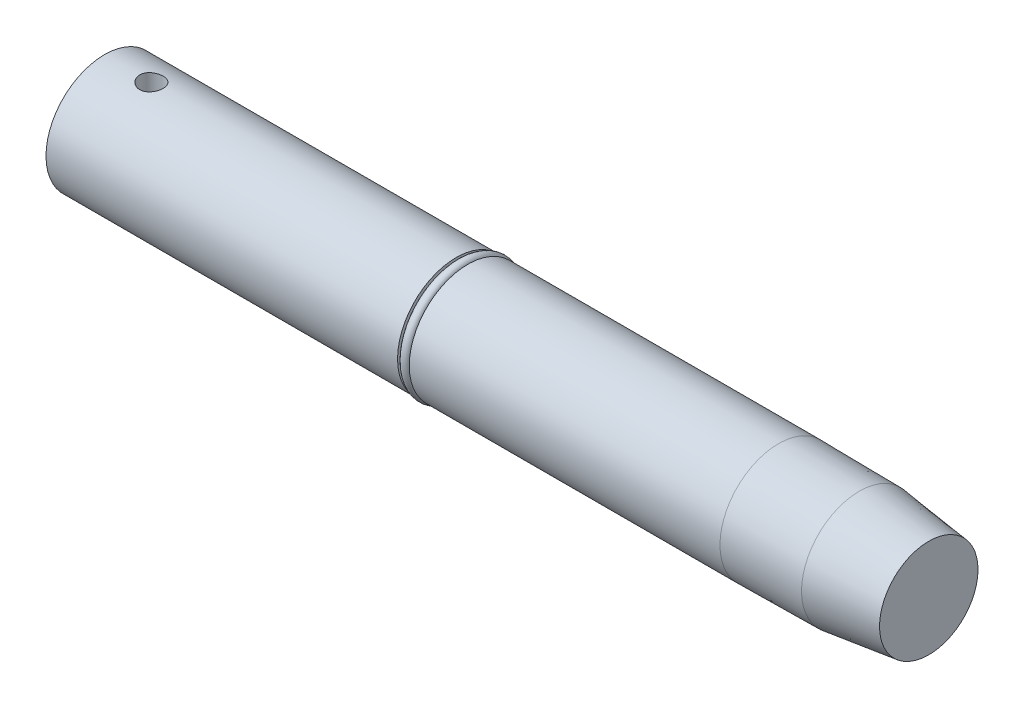
ISO-10303-21;
HEADER;
FILE_DESCRIPTION(('STEP AP214'),'2;1');
FILE_NAME('part.step','',(''),(''),'','','');
FILE_SCHEMA(('AUTOMOTIVE_DESIGN { 1 0 10303 214 1 1 1 1 }'));
ENDSEC;
DATA;
#1=APPLICATION_CONTEXT('core data for automotive mechanical design processes');
#2=APPLICATION_PROTOCOL_DEFINITION('international standard','automotive_design',2000,#1);
#3=PRODUCT_CONTEXT('',#1,'mechanical');
#4=PRODUCT('Part','Part','',(#3));
#5=PRODUCT_RELATED_PRODUCT_CATEGORY('part','',(#4));
#6=PRODUCT_DEFINITION_FORMATION('','',#4);
#7=PRODUCT_DEFINITION_CONTEXT('part definition',#1,'design');
#8=PRODUCT_DEFINITION('design','',#6,#7);
#9=PRODUCT_DEFINITION_SHAPE('','',#8);
#10=(LENGTH_UNIT() NAMED_UNIT(*) SI_UNIT(.MILLI.,.METRE.));
#11=(NAMED_UNIT(*) PLANE_ANGLE_UNIT() SI_UNIT($,.RADIAN.));
#12=(NAMED_UNIT(*) SI_UNIT($,.STERADIAN.) SOLID_ANGLE_UNIT());
#13=UNCERTAINTY_MEASURE_WITH_UNIT(LENGTH_MEASURE(1.E-05),#10,'distance_accuracy_value','');
#14=(GEOMETRIC_REPRESENTATION_CONTEXT(3) GLOBAL_UNCERTAINTY_ASSIGNED_CONTEXT((#13)) GLOBAL_UNIT_ASSIGNED_CONTEXT((#10,
#11,#12)) REPRESENTATION_CONTEXT('',''));
#15=CARTESIAN_POINT('',(0.,0.,0.));
#16=DIRECTION('',(0.,0.,1.));
#17=DIRECTION('',(1.,0.,0.));
#18=AXIS2_PLACEMENT_3D('',#15,#16,#17);
#19=CARTESIAN_POINT('',(91.5250642228962,0.,0.));
#20=DIRECTION('',(-1.,0.,0.));
#21=DIRECTION('',(0.,0.,1.));
#22=AXIS2_PLACEMENT_3D('',#19,#20,#21);
#23=TOROIDAL_SURFACE('',#22,14.1970338752884,1.2);
#24=CARTESIAN_POINT('',(91.5250642228962,0.,15.3970338752884));
#25=VERTEX_POINT('',#24);
#26=VERTEX_LOOP('',#25);
#27=FACE_BOUND('',#26,.T.);
#28=ADVANCED_FACE('F49',(#27),#23,.T.);
#29=CLOSED_SHELL('',(#28));
#30=MANIFOLD_SOLID_BREP('B2',#29);
#31=CARTESIAN_POINT('',(211.,0.,0.));
#32=DIRECTION('',(-1.,0.,0.));
#33=DIRECTION('',(0.,0.,1.));
#34=AXIS2_PLACEMENT_3D('',#31,#32,#33);
#35=CYLINDRICAL_SURFACE('',#34,15.);
#36=CARTESIAN_POINT('',(172.539848215101,0.,0.));
#37=DIRECTION('',(-1.,0.,0.));
#38=DIRECTION('',(0.,0.,1.));
#39=AXIS2_PLACEMENT_3D('',#36,#37,#38);
#40=CIRCLE('',#39,15.);
#41=CARTESIAN_POINT('',(172.539848215101,0.,15.));
#42=VERTEX_POINT('',#41);
#43=EDGE_CURVE('E129',#42,#42,#40,.T.);
#44=ORIENTED_EDGE('',*,*,#43,.T.);
#45=EDGE_LOOP('',(#44));
#46=FACE_BOUND('',#45,.T.);
#47=CARTESIAN_POINT('',(93.,0.,0.));
#48=DIRECTION('',(-1.,0.,0.));
#49=DIRECTION('',(0.,0.,1.));
#50=AXIS2_PLACEMENT_3D('',#47,#48,#49);
#51=CIRCLE('',#50,15.);
#52=CARTESIAN_POINT('',(93.,0.,15.));
#53=VERTEX_POINT('',#52);
#54=EDGE_CURVE('E132',#53,#53,#51,.T.);
#55=ORIENTED_EDGE('',*,*,#54,.F.);
#56=EDGE_LOOP('',(#55));
#57=FACE_BOUND('',#56,.T.);
#58=ADVANCED_FACE('F68',(#46,#57),#35,.T.);
#59=CARTESIAN_POINT('',(172.539848215101,0.,0.));
#60=DIRECTION('',(-1.,0.,0.));
#61=DIRECTION('',(0.,0.,1.));
#62=AXIS2_PLACEMENT_3D('',#59,#60,#61);
#63=CONICAL_SURFACE('',#62,15.,0.0103999999999929);
#64=CARTESIAN_POINT('',(193.203901879844,0.,0.));
#65=DIRECTION('',(1.,0.,0.));
#66=DIRECTION('',(0.,0.,-1.));
#67=AXIS2_PLACEMENT_3D('',#64,#65,#66);
#68=CIRCLE('',#67,14.7850860934682);
#69=CARTESIAN_POINT('',(193.203901879844,0.,-14.7850860934682));
#70=VERTEX_POINT('',#69);
#71=EDGE_CURVE('E75',#70,#70,#68,.F.);
#72=ORIENTED_EDGE('',*,*,#71,.T.);
#73=EDGE_LOOP('',(#72));
#74=FACE_BOUND('',#73,.T.);
#75=ORIENTED_EDGE('',*,*,#43,.F.);
#76=EDGE_LOOP('',(#75));
#77=FACE_BOUND('',#76,.T.);
#78=ADVANCED_FACE('F106',(#74,#77),#63,.T.);
#79=CARTESIAN_POINT('',(211.,0.,0.));
#80=DIRECTION('',(1.,0.,0.));
#81=DIRECTION('',(0.,0.,-1.));
#82=AXIS2_PLACEMENT_3D('',#79,#80,#81);
#83=PLANE('',#82);
#84=CARTESIAN_POINT('',(211.,0.,0.));
#85=DIRECTION('',(1.,0.,0.));
#86=DIRECTION('',(0.,0.,-1.));
#87=AXIS2_PLACEMENT_3D('',#84,#85,#86);
#88=CIRCLE('',#87,12.5999999999999);
#89=CARTESIAN_POINT('',(211.,0.,-12.5999999999999));
#90=VERTEX_POINT('',#89);
#91=EDGE_CURVE('E48',#90,#90,#88,.T.);
#92=ORIENTED_EDGE('',*,*,#91,.T.);
#93=EDGE_LOOP('',(#92));
#94=FACE_BOUND('',#93,.T.);
#95=ADVANCED_FACE('F108',(#94),#83,.T.);
#96=CARTESIAN_POINT('',(193.203901879844,0.,0.));
#97=DIRECTION('',(-1.,0.,0.));
#98=DIRECTION('',(0.,0.,1.));
#99=AXIS2_PLACEMENT_3D('',#96,#97,#98);
#100=CONICAL_SURFACE('',#99,14.7850860934682,0.1221730476396);
#101=ORIENTED_EDGE('',*,*,#91,.F.);
#102=EDGE_LOOP('',(#101));
#103=FACE_BOUND('',#102,.T.);
#104=ORIENTED_EDGE('',*,*,#71,.F.);
#105=EDGE_LOOP('',(#104));
#106=FACE_BOUND('',#105,.T.);
#107=ADVANCED_FACE('F70',(#103,#106),#100,.T.);
#108=CARTESIAN_POINT('',(93.,15.,0.));
#109=DIRECTION('',(-1.,0.,0.));
#110=DIRECTION('',(0.,0.,1.));
#111=AXIS2_PLACEMENT_3D('',#108,#109,#110);
#112=PLANE('',#111);
#113=ORIENTED_EDGE('',*,*,#54,.T.);
#114=EDGE_LOOP('',(#113));
#115=FACE_BOUND('',#114,.T.);
#116=CARTESIAN_POINT('',(93.,0.,0.));
#117=DIRECTION('',(-1.,0.,0.));
#118=DIRECTION('',(0.,0.,1.));
#119=AXIS2_PLACEMENT_3D('',#116,#117,#118);
#120=CIRCLE('',#119,12.9);
#121=CARTESIAN_POINT('',(93.,0.,12.9));
#122=VERTEX_POINT('',#121);
#123=EDGE_CURVE('E142',#122,#122,#120,.T.);
#124=ORIENTED_EDGE('',*,*,#123,.F.);
#125=EDGE_LOOP('',(#124));
#126=FACE_BOUND('',#125,.T.);
#127=ADVANCED_FACE('F161',(#115,#126),#112,.T.);
#128=CARTESIAN_POINT('',(98.888949173247,0.,0.));
#129=DIRECTION('',(-1.,0.,0.));
#130=DIRECTION('',(0.,0.,1.));
#131=AXIS2_PLACEMENT_3D('',#128,#129,#130);
#132=CYLINDRICAL_SURFACE('',#131,12.9);
#133=ORIENTED_EDGE('',*,*,#123,.T.);
#134=EDGE_LOOP('',(#133));
#135=FACE_BOUND('',#134,.T.);
#136=CARTESIAN_POINT('',(90.,0.,0.));
#137=DIRECTION('',(-1.,0.,0.));
#138=DIRECTION('',(0.,0.,1.));
#139=AXIS2_PLACEMENT_3D('',#136,#137,#138);
#140=CIRCLE('',#139,12.9);
#141=CARTESIAN_POINT('',(90.,0.,12.9));
#142=VERTEX_POINT('',#141);
#143=EDGE_CURVE('E137',#142,#142,#140,.T.);
#144=ORIENTED_EDGE('',*,*,#143,.F.);
#145=EDGE_LOOP('',(#144));
#146=FACE_BOUND('',#145,.T.);
#147=ADVANCED_FACE('F155',(#135,#146),#132,.T.);
#148=CARTESIAN_POINT('',(90.,15.,0.));
#149=DIRECTION('',(1.,0.,0.));
#150=DIRECTION('',(0.,0.,-1.));
#151=AXIS2_PLACEMENT_3D('',#148,#149,#150);
#152=PLANE('',#151);
#153=ORIENTED_EDGE('',*,*,#143,.T.);
#154=EDGE_LOOP('',(#153));
#155=FACE_BOUND('',#154,.T.);
#156=CARTESIAN_POINT('',(90.,0.,0.));
#157=DIRECTION('',(-1.,0.,0.));
#158=DIRECTION('',(0.,0.,1.));
#159=AXIS2_PLACEMENT_3D('',#156,#157,#158);
#160=CIRCLE('',#159,15.);
#161=CARTESIAN_POINT('',(90.,0.,15.));
#162=VERTEX_POINT('',#161);
#163=EDGE_CURVE('E134',#162,#162,#160,.T.);
#164=ORIENTED_EDGE('',*,*,#163,.F.);
#165=EDGE_LOOP('',(#164));
#166=FACE_BOUND('',#165,.T.);
#167=ADVANCED_FACE('F104',(#155,#166),#152,.T.);
#168=CARTESIAN_POINT('',(12.,199.,0.));
#169=DIRECTION('',(0.,-1.,0.));
#170=DIRECTION('',(0.,0.,-1.));
#171=AXIS2_PLACEMENT_3D('',#168,#169,#170);
#172=CYLINDRICAL_SURFACE('',#171,3.);
#173=CARTESIAN_POINT('',(12.,-14.6969384566991,-3.));
#174=CARTESIAN_POINT('',(12.1666931264735,-14.6969417707994,-2.99999383762581));
#175=CARTESIAN_POINT('',(12.33346387,-14.6998052480611,-2.98605951515443));
#176=CARTESIAN_POINT('',(12.6622875154294,-14.7109329391462,-2.93073685074852));
#177=CARTESIAN_POINT('',(12.8243365339079,-14.7192014743436,-2.88932654121148));
#178=CARTESIAN_POINT('',(13.1389119100626,-14.7401662116556,-2.78038734785923));
#179=CARTESIAN_POINT('',(13.2914475645978,-14.7528580086323,-2.71288444245786));
#180=CARTESIAN_POINT('',(13.5830245340909,-14.7812339844198,-2.55374732301151));
#181=CARTESIAN_POINT('',(13.7220666016137,-14.7969179962038,-2.46211445580345));
#182=CARTESIAN_POINT('',(13.9846830115616,-14.8297589908276,-2.25593722696031));
#183=CARTESIAN_POINT('',(14.1080387636519,-14.8469321351174,-2.14111696773995));
#184=CARTESIAN_POINT('',(14.3338726007369,-14.880674169078,-1.89242036706393));
#185=CARTESIAN_POINT('',(14.4363492222516,-14.8972430163249,-1.75854269093395));
#186=CARTESIAN_POINT('',(14.6183640528854,-14.9280838925269,-1.47408406777276));
#187=CARTESIAN_POINT('',(14.6976945414499,-14.9423346432465,-1.32336770301663));
#188=CARTESIAN_POINT('',(14.8298248111444,-14.9667521065089,-1.01041245116181));
#189=CARTESIAN_POINT('',(14.882627075703,-14.9769192013236,-0.848174644261658));
#190=CARTESIAN_POINT('',(14.9595215808589,-14.9919096206526,-0.519050319835482));
#191=CARTESIAN_POINT('',(14.983982932713,-14.9968015886438,-0.352253217644441));
#192=CARTESIAN_POINT('',(15.0046528555149,-15.0009276355081,-0.016855705312608));
#193=CARTESIAN_POINT('',(15.0008641489375,-15.0001622595828,0.15174452949553));
#194=CARTESIAN_POINT('',(14.9654214593533,-14.9931130460555,0.483426002230766));
#195=CARTESIAN_POINT('',(14.9341650684965,-14.9869079509751,0.64655164289541));
#196=CARTESIAN_POINT('',(14.8453049026233,-14.9697653147823,0.965194879740903));
#197=CARTESIAN_POINT('',(14.7877000734244,-14.9588275843212,1.12071217124139));
#198=CARTESIAN_POINT('',(14.6474098795582,-14.9333188805988,1.42085838960266));
#199=CARTESIAN_POINT('',(14.5645687466853,-14.9187254452567,1.5654125224017));
#200=CARTESIAN_POINT('',(14.3762727682902,-14.8875140842136,1.83871513757927));
#201=CARTESIAN_POINT('',(14.2708153206885,-14.8708959256567,1.967461798575));
#202=CARTESIAN_POINT('',(14.0380991336746,-14.8371289309338,2.20785429316037));
#203=CARTESIAN_POINT('',(13.9104924398112,-14.8199758937255,2.31916294972089));
#204=CARTESIAN_POINT('',(13.6382506726477,-14.7873471479628,2.51885547953042));
#205=CARTESIAN_POINT('',(13.4936152773504,-14.7718714711364,2.60723891918325));
#206=CARTESIAN_POINT('',(13.1909375045346,-14.7443414241877,2.75868844440564));
#207=CARTESIAN_POINT('',(13.032867097081,-14.7322944469065,2.82169994333313));
#208=CARTESIAN_POINT('',(12.708086028828,-14.7130942896382,2.92017102488274));
#209=CARTESIAN_POINT('',(12.5413764971427,-14.7059404718528,2.95563419836992));
#210=CARTESIAN_POINT('',(12.2071054260029,-14.6974643780348,2.99749801810815));
#211=CARTESIAN_POINT('',(12.039607277069,-14.6960444117146,3.00438557669373));
#212=CARTESIAN_POINT('',(11.7058553304009,-14.6989345706656,2.99021288493221));
#213=CARTESIAN_POINT('',(11.5396014626434,-14.7032443710116,2.96915421936732));
#214=CARTESIAN_POINT('',(11.2146940791233,-14.7170169748474,2.90010662422247));
#215=CARTESIAN_POINT('',(11.0559829708927,-14.7264299704349,2.85237786251789));
#216=CARTESIAN_POINT('',(10.7488101629138,-14.7493046805499,2.73162310592555));
#217=CARTESIAN_POINT('',(10.6003493086928,-14.7627667285881,2.65859502711953));
#218=CARTESIAN_POINT('',(10.3157606701495,-14.7924421788612,2.48821242664679));
#219=CARTESIAN_POINT('',(10.1798188610975,-14.8086891559471,2.39055323394826));
#220=CARTESIAN_POINT('',(9.92607506399725,-14.8420117147991,2.17408671663813));
#221=CARTESIAN_POINT('',(9.80827494525224,-14.8590873817145,2.05527721543361));
#222=CARTESIAN_POINT('',(9.59231232244327,-14.8924603760765,1.79769682049367));
#223=CARTESIAN_POINT('',(9.49447903605001,-14.9087417312605,1.65864749678889));
#224=CARTESIAN_POINT('',(9.32356235550125,-14.9384138288586,1.36580368990426));
#225=CARTESIAN_POINT('',(9.25047792196566,-14.9518046926563,1.21200982630052));
#226=CARTESIAN_POINT('',(9.1316133847601,-14.974118821832,0.894908042472038));
#227=CARTESIAN_POINT('',(9.08567844532124,-14.9830673742781,0.731660020434235));
#228=CARTESIAN_POINT('',(9.02192625700847,-14.9955970781298,0.399568364039736));
#229=CARTESIAN_POINT('',(9.00410562157297,-14.9991788759955,0.230725406133635));
#230=CARTESIAN_POINT('',(8.99721905711133,-15.0005562136234,-0.104618681710864));
#231=CARTESIAN_POINT('',(9.00765815863132,-14.9984513564799,-0.271109436424482));
#232=CARTESIAN_POINT('',(9.05590185164349,-14.9889013068102,-0.599913093946949));
#233=CARTESIAN_POINT('',(9.0937060990444,-14.9814561814329,-0.762226049261167));
#234=CARTESIAN_POINT('',(9.19538697627477,-14.9620649509476,-1.07775824923519));
#235=CARTESIAN_POINT('',(9.25920413439293,-14.9501291174284,-1.23099732972049));
#236=CARTESIAN_POINT('',(9.41103672399333,-14.9230416637104,-1.52466366055821));
#237=CARTESIAN_POINT('',(9.4990540677135,-14.9078897894096,-1.66508989730354));
#238=CARTESIAN_POINT('',(9.69845816118386,-14.8757279747022,-1.93159167031775));
#239=CARTESIAN_POINT('',(9.81019900915133,-14.858692002537,-2.05739914834453));
#240=CARTESIAN_POINT('',(10.0531507202963,-14.8248366872359,-2.28864785327552));
#241=CARTESIAN_POINT('',(10.1843661884398,-14.8080173963616,-2.39408424962674));
#242=CARTESIAN_POINT('',(10.4642379500713,-14.7763002820179,-2.58267665834994));
#243=CARTESIAN_POINT('',(10.6130668833638,-14.7614251071368,-2.66558044385427));
#244=CARTESIAN_POINT('',(10.9227983197803,-14.7355571137924,-2.80507214779868));
#245=CARTESIAN_POINT('',(11.0836897160616,-14.7245607757495,-2.86168393792249));
#246=CARTESIAN_POINT('',(11.3707873663286,-14.7098904341354,-2.93600741957296));
#247=CARTESIAN_POINT('',(11.4953562585419,-14.7050635474382,-2.95996169557105));
#248=CARTESIAN_POINT('',(11.7466018636534,-14.6985863537725,-2.99196005387913));
#249=CARTESIAN_POINT('',(11.8732785037334,-14.6969359372925,-3.00000468468793));
#250=CARTESIAN_POINT('',(12.,-14.6969384566991,-3.));
#251=B_SPLINE_CURVE_WITH_KNOTS('',3,(#173,#174,#175,#176,#177,#178,#179,#180,#181,#182,#183,
#184,#185,#186,#187,#188,#189,#190,#191,#192,#193,#194,#195,#196,#197,#198,#199,#200,#201,#202,
#203,#204,#205,#206,#207,#208,#209,#210,#211,#212,#213,#214,#215,#216,#217,#218,#219,#220,#221,
#222,#223,#224,#225,#226,#227,#228,#229,#230,#231,#232,#233,#234,#235,#236,#237,#238,#239,#240,
#241,#242,#243,#244,#245,#246,#247,#248,#249,#250),.UNSPECIFIED.,.T.,.F.,(4,2,2,2,2,2,2,2,2,2,2,
2,2,2,2,2,2,2,2,2,2,2,2,2,2,2,2,2,2,2,2,2,2,2,2,2,2,2,4),(0.,0.499615391608285,
0.999630717852889,1.49914949382176,1.99864039457959,2.5044675764531,3.01033020106266,
3.5206020131235,4.03082604739679,4.53432746649241,5.03778036348745,5.53406368900612,
6.0303668722125,6.52979772666909,7.02928607310198,7.5374804028745,8.04568434368161,
8.55497589518329,9.06420105048074,9.5647127341378,10.0651960358526,10.5608802534996,
11.0566053106319,11.5587917932356,12.0610299861063,12.5709780520035,13.0809046989031,
13.5878944073595,14.0948230407488,14.5929305224406,15.0910317410027,15.5880005122635,
16.0850085640405,16.5900345607679,17.0951801666934,17.6057669573882,18.1158892527059,
18.4957141091448,18.8755258705644),.UNSPECIFIED.);
#252=CARTESIAN_POINT('',(12.,-14.6969384566991,-3.));
#253=VERTEX_POINT('',#252);
#254=EDGE_CURVE('E92',#253,#253,#251,.T.);
#255=ORIENTED_EDGE('',*,*,#254,.T.);
#256=EDGE_LOOP('',(#255));
#257=FACE_BOUND('',#256,.T.);
#258=CARTESIAN_POINT('',(12.,14.6969384566991,-3.));
#259=CARTESIAN_POINT('',(11.8333068735265,14.6969417707994,-2.99999383762581));
#260=CARTESIAN_POINT('',(11.66653613,14.6998052480611,-2.98605951515443));
#261=CARTESIAN_POINT('',(11.3377124845706,14.7109329391462,-2.93073685074852));
#262=CARTESIAN_POINT('',(11.1756634660921,14.7192014743436,-2.88932654121148));
#263=CARTESIAN_POINT('',(10.8610880899374,14.7401662116556,-2.78038734785923));
#264=CARTESIAN_POINT('',(10.7085524354022,14.7528580086323,-2.71288444245786));
#265=CARTESIAN_POINT('',(10.4169754659091,14.7812339844198,-2.55374732301151));
#266=CARTESIAN_POINT('',(10.2779333983863,14.7969179962038,-2.46211445580345));
#267=CARTESIAN_POINT('',(10.0153169884384,14.8297589908276,-2.25593722696031));
#268=CARTESIAN_POINT('',(9.89196123634808,14.8469321351174,-2.14111696773995));
#269=CARTESIAN_POINT('',(9.66612739926306,14.880674169078,-1.89242036706393));
#270=CARTESIAN_POINT('',(9.56365077774842,14.8972430163249,-1.75854269093395));
#271=CARTESIAN_POINT('',(9.38163594711462,14.9280838925269,-1.47408406777276));
#272=CARTESIAN_POINT('',(9.30230545855008,14.9423346432465,-1.32336770301663));
#273=CARTESIAN_POINT('',(9.17017518885559,14.9667521065089,-1.01041245116181));
#274=CARTESIAN_POINT('',(9.11737292429703,14.9769192013236,-0.848174644261657));
#275=CARTESIAN_POINT('',(9.04047841914113,14.9919096206526,-0.519050319835482));
#276=CARTESIAN_POINT('',(9.01601706728698,14.9968015886438,-0.352253217644441));
#277=CARTESIAN_POINT('',(8.99534714448506,15.0009276355081,-0.016855705312608));
#278=CARTESIAN_POINT('',(8.99913585106254,15.0001622595828,0.15174452949553));
#279=CARTESIAN_POINT('',(9.03457854064667,14.9931130460555,0.483426002230766));
#280=CARTESIAN_POINT('',(9.06583493150355,14.9869079509751,0.64655164289541));
#281=CARTESIAN_POINT('',(9.15469509737668,14.9697653147823,0.965194879740903));
#282=CARTESIAN_POINT('',(9.21229992657562,14.9588275843212,1.12071217124139));
#283=CARTESIAN_POINT('',(9.35259012044181,14.9333188805988,1.42085838960266));
#284=CARTESIAN_POINT('',(9.43543125331467,14.9187254452567,1.5654125224017));
#285=CARTESIAN_POINT('',(9.6237272317098,14.8875140842136,1.83871513757927));
#286=CARTESIAN_POINT('',(9.72918467931155,14.8708959256567,1.967461798575));
#287=CARTESIAN_POINT('',(9.96190086632542,14.8371289309338,2.20785429316037));
#288=CARTESIAN_POINT('',(10.0895075601888,14.8199758937255,2.31916294972089));
#289=CARTESIAN_POINT('',(10.3617493273523,14.7873471479628,2.51885547953042));
#290=CARTESIAN_POINT('',(10.5063847226496,14.7718714711364,2.60723891918325));
#291=CARTESIAN_POINT('',(10.8090624954654,14.7443414241877,2.75868844440564));
#292=CARTESIAN_POINT('',(10.967132902919,14.7322944469065,2.82169994333313));
#293=CARTESIAN_POINT('',(11.291913971172,14.7130942896382,2.92017102488274));
#294=CARTESIAN_POINT('',(11.4586235028573,14.7059404718528,2.95563419836993));
#295=CARTESIAN_POINT('',(11.7928945739971,14.6974643780348,2.99749801810815));
#296=CARTESIAN_POINT('',(11.960392722931,14.6960444117146,3.00438557669373));
#297=CARTESIAN_POINT('',(12.2941446695991,14.6989345706656,2.99021288493221));
#298=CARTESIAN_POINT('',(12.4603985373566,14.7032443710116,2.96915421936732));
#299=CARTESIAN_POINT('',(12.7853059208767,14.7170169748474,2.90010662422247));
#300=CARTESIAN_POINT('',(12.9440170291073,14.7264299704349,2.85237786251789));
#301=CARTESIAN_POINT('',(13.2511898370862,14.7493046805499,2.73162310592555));
#302=CARTESIAN_POINT('',(13.3996506913072,14.7627667285881,2.65859502711953));
#303=CARTESIAN_POINT('',(13.6842393298505,14.7924421788612,2.48821242664679));
#304=CARTESIAN_POINT('',(13.8201811389025,14.8086891559471,2.39055323394826));
#305=CARTESIAN_POINT('',(14.0739249360027,14.8420117147991,2.17408671663813));
#306=CARTESIAN_POINT('',(14.1917250547478,14.8590873817145,2.05527721543361));
#307=CARTESIAN_POINT('',(14.4076876775567,14.8924603760765,1.79769682049367));
#308=CARTESIAN_POINT('',(14.50552096395,14.9087417312605,1.65864749678889));
#309=CARTESIAN_POINT('',(14.6764376444987,14.9384138288586,1.36580368990426));
#310=CARTESIAN_POINT('',(14.7495220780343,14.9518046926563,1.21200982630052));
#311=CARTESIAN_POINT('',(14.8683866152399,14.974118821832,0.894908042472038));
#312=CARTESIAN_POINT('',(14.9143215546788,14.9830673742781,0.731660020434235));
#313=CARTESIAN_POINT('',(14.9780737429915,14.9955970781298,0.399568364039735));
#314=CARTESIAN_POINT('',(14.995894378427,14.9991788759955,0.230725406133635));
#315=CARTESIAN_POINT('',(15.0027809428887,15.0005562136234,-0.104618681710864));
#316=CARTESIAN_POINT('',(14.9923418413687,14.9984513564799,-0.271109436424482));
#317=CARTESIAN_POINT('',(14.9440981483565,14.9889013068102,-0.599913093946949));
#318=CARTESIAN_POINT('',(14.9062939009556,14.9814561814329,-0.762226049261167));
#319=CARTESIAN_POINT('',(14.8046130237252,14.9620649509476,-1.07775824923519));
#320=CARTESIAN_POINT('',(14.7407958656071,14.9501291174284,-1.23099732972049));
#321=CARTESIAN_POINT('',(14.5889632760067,14.9230416637104,-1.52466366055821));
#322=CARTESIAN_POINT('',(14.5009459322865,14.9078897894096,-1.66508989730354));
#323=CARTESIAN_POINT('',(14.3015418388161,14.8757279747022,-1.93159167031775));
#324=CARTESIAN_POINT('',(14.1898009908487,14.858692002537,-2.05739914834453));
#325=CARTESIAN_POINT('',(13.9468492797037,14.8248366872359,-2.28864785327552));
#326=CARTESIAN_POINT('',(13.8156338115602,14.8080173963616,-2.39408424962674));
#327=CARTESIAN_POINT('',(13.5357620499287,14.7763002820179,-2.58267665834994));
#328=CARTESIAN_POINT('',(13.3869331166362,14.7614251071368,-2.66558044385427));
#329=CARTESIAN_POINT('',(13.0772016802197,14.7355571137924,-2.80507214779868));
#330=CARTESIAN_POINT('',(12.9163102839384,14.7245607757495,-2.86168393792249));
#331=CARTESIAN_POINT('',(12.6292126336714,14.7098904341354,-2.93600741957296));
#332=CARTESIAN_POINT('',(12.5046437414581,14.7050635474382,-2.95996169557105));
#333=CARTESIAN_POINT('',(12.2533981363466,14.6985863537725,-2.99196005387913));
#334=CARTESIAN_POINT('',(12.1267214962666,14.6969359372925,-3.00000468468793));
#335=CARTESIAN_POINT('',(12.,14.6969384566991,-3.));
#336=B_SPLINE_CURVE_WITH_KNOTS('',3,(#258,#259,#260,#261,#262,#263,#264,#265,#266,#267,#268,
#269,#270,#271,#272,#273,#274,#275,#276,#277,#278,#279,#280,#281,#282,#283,#284,#285,#286,#287,
#288,#289,#290,#291,#292,#293,#294,#295,#296,#297,#298,#299,#300,#301,#302,#303,#304,#305,#306,
#307,#308,#309,#310,#311,#312,#313,#314,#315,#316,#317,#318,#319,#320,#321,#322,#323,#324,#325,
#326,#327,#328,#329,#330,#331,#332,#333,#334,#335),.UNSPECIFIED.,.T.,.F.,(4,2,2,2,2,2,2,2,2,2,2,
2,2,2,2,2,2,2,2,2,2,2,2,2,2,2,2,2,2,2,2,2,2,2,2,2,2,2,4),(0.,0.499615391608285,
0.999630717852889,1.49914949382176,1.99864039457959,2.5044675764531,3.01033020106266,
3.52060201312351,4.03082604739679,4.53432746649241,5.03778036348744,5.53406368900612,
6.0303668722125,6.52979772666909,7.02928607310198,7.53748040287449,8.0456843436816,
8.5549758951833,9.06420105048074,9.5647127341378,10.0651960358526,10.5608802534996,
11.0566053106319,11.5587917932356,12.0610299861063,12.5709780520035,13.0809046989031,
13.5878944073595,14.0948230407488,14.5929305224406,15.0910317410027,15.5880005122635,
16.0850085640405,16.5900345607679,17.0951801666934,17.6057669573882,18.1158892527059,
18.4957141091448,18.8755258705644),.UNSPECIFIED.);
#337=CARTESIAN_POINT('',(12.,14.6969384566991,-3.));
#338=VERTEX_POINT('',#337);
#339=EDGE_CURVE('E83',#338,#338,#336,.T.);
#340=ORIENTED_EDGE('',*,*,#339,.T.);
#341=EDGE_LOOP('',(#340));
#342=FACE_BOUND('',#341,.T.);
#343=ADVANCED_FACE('F98',(#257,#342),#172,.F.);
#344=CARTESIAN_POINT('',(0.,0.,0.));
#345=DIRECTION('',(1.,0.,0.));
#346=DIRECTION('',(0.,0.,-1.));
#347=AXIS2_PLACEMENT_3D('',#344,#345,#346);
#348=PLANE('',#347);
#349=CARTESIAN_POINT('',(0.,0.,0.));
#350=DIRECTION('',(1.,0.,0.));
#351=DIRECTION('',(0.,0.,-1.));
#352=AXIS2_PLACEMENT_3D('',#349,#350,#351);
#353=CIRCLE('',#352,15.);
#354=CARTESIAN_POINT('',(0.,0.,-15.));
#355=VERTEX_POINT('',#354);
#356=EDGE_CURVE('E79',#355,#355,#353,.T.);
#357=ORIENTED_EDGE('',*,*,#356,.F.);
#358=EDGE_LOOP('',(#357));
#359=FACE_BOUND('',#358,.T.);
#360=ADVANCED_FACE('F103',(#359),#348,.F.);
#361=ORIENTED_EDGE('',*,*,#356,.T.);
#362=EDGE_LOOP('',(#361));
#363=FACE_BOUND('',#362,.T.);
#364=ORIENTED_EDGE('',*,*,#254,.F.);
#365=EDGE_LOOP('',(#364));
#366=FACE_BOUND('',#365,.T.);
#367=ORIENTED_EDGE('',*,*,#339,.F.);
#368=EDGE_LOOP('',(#367));
#369=FACE_BOUND('',#368,.T.);
#370=ORIENTED_EDGE('',*,*,#163,.T.);
#371=EDGE_LOOP('',(#370));
#372=FACE_BOUND('',#371,.T.);
#373=ADVANCED_FACE('F112',(#363,#366,#369,#372),#35,.T.);
#374=CLOSED_SHELL('',(#58,#78,#95,#107,#127,#147,#167,#343,#360,#373));
#375=MANIFOLD_SOLID_BREP('B6',#374);
#376=ADVANCED_BREP_SHAPE_REPRESENTATION('',(#18,#30,#375),#14);
#377=SHAPE_DEFINITION_REPRESENTATION(#9,#376);
ENDSEC;
END-ISO-10303-21;
